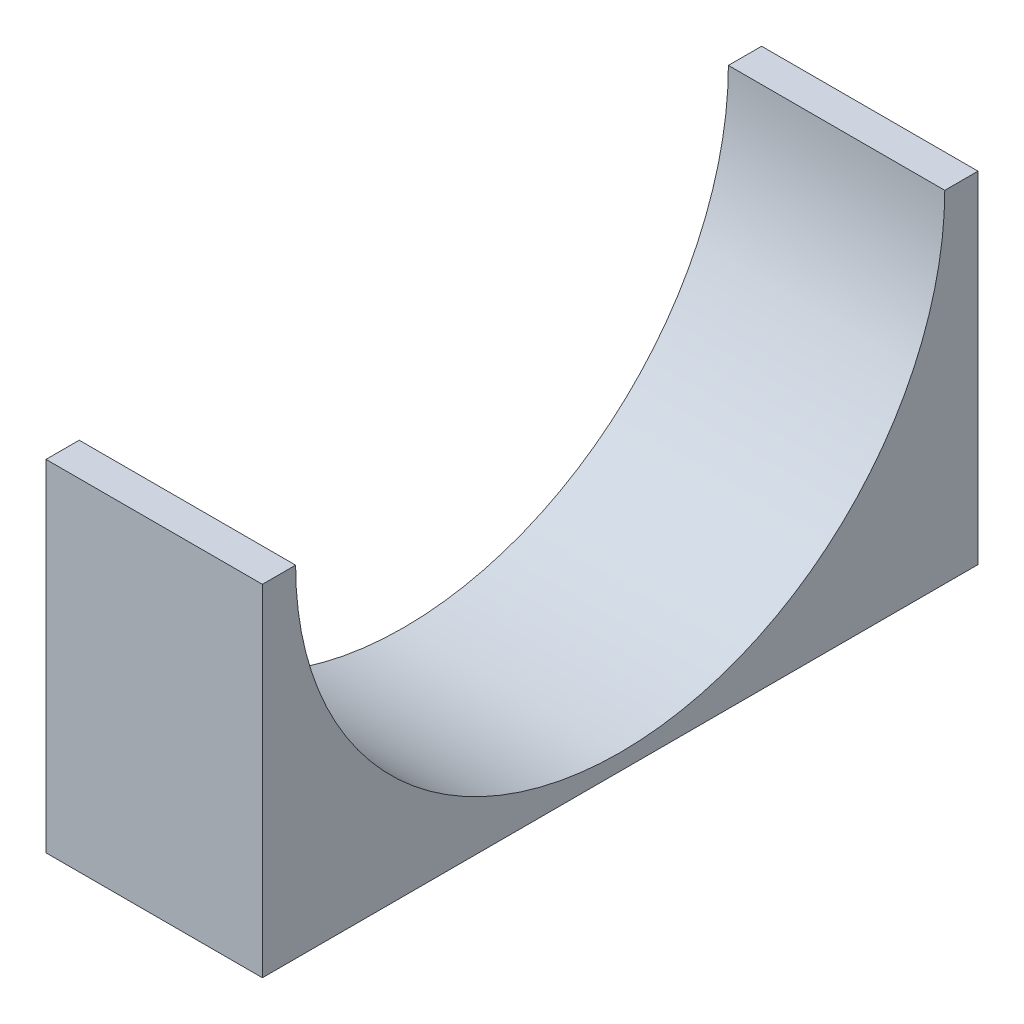
ISO-10303-21;
HEADER;
FILE_DESCRIPTION(('STEP AP214'),'2;1');
FILE_NAME('part.step','',(''),(''),'','','');
FILE_SCHEMA(('AUTOMOTIVE_DESIGN { 1 0 10303 214 1 1 1 1 }'));
ENDSEC;
DATA;
#1=APPLICATION_CONTEXT('core data for automotive mechanical design processes');
#2=APPLICATION_PROTOCOL_DEFINITION('international standard','automotive_design',2000,#1);
#3=PRODUCT_CONTEXT('',#1,'mechanical');
#4=PRODUCT('Part','Part','',(#3));
#5=PRODUCT_RELATED_PRODUCT_CATEGORY('part','',(#4));
#6=PRODUCT_DEFINITION_FORMATION('','',#4);
#7=PRODUCT_DEFINITION_CONTEXT('part definition',#1,'design');
#8=PRODUCT_DEFINITION('design','',#6,#7);
#9=PRODUCT_DEFINITION_SHAPE('','',#8);
#10=(LENGTH_UNIT() NAMED_UNIT(*) SI_UNIT(.MILLI.,.METRE.));
#11=(NAMED_UNIT(*) PLANE_ANGLE_UNIT() SI_UNIT($,.RADIAN.));
#12=(NAMED_UNIT(*) SI_UNIT($,.STERADIAN.) SOLID_ANGLE_UNIT());
#13=UNCERTAINTY_MEASURE_WITH_UNIT(LENGTH_MEASURE(1.E-05),#10,'distance_accuracy_value','');
#14=(GEOMETRIC_REPRESENTATION_CONTEXT(3) GLOBAL_UNCERTAINTY_ASSIGNED_CONTEXT((#13)) GLOBAL_UNIT_ASSIGNED_CONTEXT((#10,
#11,#12)) REPRESENTATION_CONTEXT('',''));
#15=CARTESIAN_POINT('',(0.,0.,0.));
#16=DIRECTION('',(0.,0.,1.));
#17=DIRECTION('',(1.,0.,0.));
#18=AXIS2_PLACEMENT_3D('',#15,#16,#17);
#19=CARTESIAN_POINT('',(0.,40.,0.));
#20=DIRECTION('',(0.,1.,0.));
#21=DIRECTION('',(0.,0.,1.));
#22=AXIS2_PLACEMENT_3D('',#19,#20,#21);
#23=PLANE('',#22);
#24=DIRECTION('',(1.,0.,0.));
#25=VECTOR('',#24,1.);
#26=CARTESIAN_POINT('',(-15.,40.,38.1));
#27=LINE('',#26,#25);
#28=CARTESIAN_POINT('',(-12.7,40.,38.1));
#29=VERTEX_POINT('',#28);
#30=CARTESIAN_POINT('',(12.7,40.,38.1));
#31=VERTEX_POINT('',#30);
#32=EDGE_CURVE('E11',#29,#31,#27,.T.);
#33=ORIENTED_EDGE('',*,*,#32,.F.);
#34=DIRECTION('',(0.,0.,1.));
#35=VECTOR('',#34,1.);
#36=CARTESIAN_POINT('',(-12.7,40.,-42.));
#37=LINE('',#36,#35);
#38=CARTESIAN_POINT('',(-12.7,40.,42.));
#39=VERTEX_POINT('',#38);
#40=EDGE_CURVE('E113',#29,#39,#37,.T.);
#41=ORIENTED_EDGE('',*,*,#40,.T.);
#42=DIRECTION('',(1.,0.,0.));
#43=VECTOR('',#42,1.);
#44=CARTESIAN_POINT('',(-12.7,40.,42.));
#45=LINE('',#44,#43);
#46=CARTESIAN_POINT('',(12.7,40.,42.));
#47=VERTEX_POINT('',#46);
#48=EDGE_CURVE('E63',#39,#47,#45,.T.);
#49=ORIENTED_EDGE('',*,*,#48,.T.);
#50=DIRECTION('',(0.,0.,-1.));
#51=VECTOR('',#50,1.);
#52=CARTESIAN_POINT('',(12.7,40.,-42.));
#53=LINE('',#52,#51);
#54=EDGE_CURVE('E160',#47,#31,#53,.T.);
#55=ORIENTED_EDGE('',*,*,#54,.T.);
#56=EDGE_LOOP('',(#33,#41,#49,#55));
#57=FACE_BOUND('',#56,.T.);
#58=ADVANCED_FACE('F39',(#57),#23,.T.);
#59=CARTESIAN_POINT('',(12.7,40.,-42.));
#60=DIRECTION('',(-1.,0.,0.));
#61=DIRECTION('',(0.,0.,1.));
#62=AXIS2_PLACEMENT_3D('',#59,#60,#61);
#63=PLANE('',#62);
#64=CARTESIAN_POINT('',(12.7,40.,-38.1));
#65=VERTEX_POINT('',#64);
#66=CARTESIAN_POINT('',(12.7,40.,-42.));
#67=VERTEX_POINT('',#66);
#68=EDGE_CURVE('E91',#65,#67,#53,.T.);
#69=ORIENTED_EDGE('',*,*,#68,.F.);
#70=CARTESIAN_POINT('',(12.7,40.,0.));
#71=DIRECTION('',(-1.,0.,0.));
#72=DIRECTION('',(0.,0.,1.));
#73=AXIS2_PLACEMENT_3D('',#70,#71,#72);
#74=CIRCLE('',#73,38.1);
#75=EDGE_CURVE('E54',#65,#31,#74,.T.);
#76=ORIENTED_EDGE('',*,*,#75,.T.);
#77=ORIENTED_EDGE('',*,*,#54,.F.);
#78=DIRECTION('',(0.,-1.,0.));
#79=VECTOR('',#78,1.);
#80=CARTESIAN_POINT('',(12.7,40.,42.));
#81=LINE('',#80,#79);
#82=CARTESIAN_POINT('',(12.7,0.,42.));
#83=VERTEX_POINT('',#82);
#84=EDGE_CURVE('E123',#47,#83,#81,.T.);
#85=ORIENTED_EDGE('',*,*,#84,.T.);
#86=DIRECTION('',(0.,0.,-1.));
#87=VECTOR('',#86,1.);
#88=CARTESIAN_POINT('',(12.7,0.,-42.));
#89=LINE('',#88,#87);
#90=CARTESIAN_POINT('',(12.7,0.,-42.));
#91=VERTEX_POINT('',#90);
#92=EDGE_CURVE('E128',#83,#91,#89,.T.);
#93=ORIENTED_EDGE('',*,*,#92,.T.);
#94=DIRECTION('',(0.,-1.,0.));
#95=VECTOR('',#94,1.);
#96=CARTESIAN_POINT('',(12.7,40.,-42.));
#97=LINE('',#96,#95);
#98=EDGE_CURVE('E105',#67,#91,#97,.T.);
#99=ORIENTED_EDGE('',*,*,#98,.F.);
#100=EDGE_LOOP('',(#69,#76,#77,#85,#93,#99));
#101=FACE_BOUND('',#100,.T.);
#102=ADVANCED_FACE('F41',(#101),#63,.F.);
#103=CARTESIAN_POINT('',(-12.7,40.,-42.));
#104=DIRECTION('',(0.,0.,1.));
#105=DIRECTION('',(1.,0.,0.));
#106=AXIS2_PLACEMENT_3D('',#103,#104,#105);
#107=PLANE('',#106);
#108=DIRECTION('',(-1.,0.,0.));
#109=VECTOR('',#108,1.);
#110=CARTESIAN_POINT('',(-12.7,0.,-42.));
#111=LINE('',#110,#109);
#112=CARTESIAN_POINT('',(-12.7,0.,-42.));
#113=VERTEX_POINT('',#112);
#114=EDGE_CURVE('E132',#91,#113,#111,.T.);
#115=ORIENTED_EDGE('',*,*,#114,.T.);
#116=DIRECTION('',(0.,-1.,0.));
#117=VECTOR('',#116,1.);
#118=CARTESIAN_POINT('',(-12.7,40.,-42.));
#119=LINE('',#118,#117);
#120=CARTESIAN_POINT('',(-12.7,40.,-42.));
#121=VERTEX_POINT('',#120);
#122=EDGE_CURVE('E145',#121,#113,#119,.T.);
#123=ORIENTED_EDGE('',*,*,#122,.F.);
#124=DIRECTION('',(-1.,0.,0.));
#125=VECTOR('',#124,1.);
#126=CARTESIAN_POINT('',(-12.7,40.,-42.));
#127=LINE('',#126,#125);
#128=EDGE_CURVE('E117',#67,#121,#127,.T.);
#129=ORIENTED_EDGE('',*,*,#128,.F.);
#130=ORIENTED_EDGE('',*,*,#98,.T.);
#131=EDGE_LOOP('',(#115,#123,#129,#130));
#132=FACE_BOUND('',#131,.T.);
#133=ADVANCED_FACE('F152',(#132),#107,.F.);
#134=CARTESIAN_POINT('',(-12.7,40.,-42.));
#135=DIRECTION('',(1.,0.,0.));
#136=DIRECTION('',(0.,0.,-1.));
#137=AXIS2_PLACEMENT_3D('',#134,#135,#136);
#138=PLANE('',#137);
#139=ORIENTED_EDGE('',*,*,#40,.F.);
#140=CARTESIAN_POINT('',(-12.7,40.,0.));
#141=DIRECTION('',(1.,0.,0.));
#142=DIRECTION('',(0.,0.,-1.));
#143=AXIS2_PLACEMENT_3D('',#140,#141,#142);
#144=CIRCLE('',#143,38.1);
#145=CARTESIAN_POINT('',(-12.7,40.,-38.1));
#146=VERTEX_POINT('',#145);
#147=EDGE_CURVE('E101',#29,#146,#144,.T.);
#148=ORIENTED_EDGE('',*,*,#147,.T.);
#149=EDGE_CURVE('E111',#121,#146,#37,.T.);
#150=ORIENTED_EDGE('',*,*,#149,.F.);
#151=ORIENTED_EDGE('',*,*,#122,.T.);
#152=DIRECTION('',(0.,0.,1.));
#153=VECTOR('',#152,1.);
#154=CARTESIAN_POINT('',(-12.7,0.,-42.));
#155=LINE('',#154,#153);
#156=CARTESIAN_POINT('',(-12.7,0.,42.));
#157=VERTEX_POINT('',#156);
#158=EDGE_CURVE('E135',#113,#157,#155,.T.);
#159=ORIENTED_EDGE('',*,*,#158,.T.);
#160=DIRECTION('',(0.,-1.,0.));
#161=VECTOR('',#160,1.);
#162=CARTESIAN_POINT('',(-12.7,40.,42.));
#163=LINE('',#162,#161);
#164=EDGE_CURVE('E142',#39,#157,#163,.T.);
#165=ORIENTED_EDGE('',*,*,#164,.F.);
#166=EDGE_LOOP('',(#139,#148,#150,#151,#159,#165));
#167=FACE_BOUND('',#166,.T.);
#168=ADVANCED_FACE('F109',(#167),#138,.F.);
#169=CARTESIAN_POINT('',(-12.7,40.,42.));
#170=DIRECTION('',(0.,0.,-1.));
#171=DIRECTION('',(-1.,0.,0.));
#172=AXIS2_PLACEMENT_3D('',#169,#170,#171);
#173=PLANE('',#172);
#174=DIRECTION('',(1.,0.,0.));
#175=VECTOR('',#174,1.);
#176=CARTESIAN_POINT('',(-12.7,0.,42.));
#177=LINE('',#176,#175);
#178=EDGE_CURVE('E84',#157,#83,#177,.T.);
#179=ORIENTED_EDGE('',*,*,#178,.T.);
#180=ORIENTED_EDGE('',*,*,#84,.F.);
#181=ORIENTED_EDGE('',*,*,#48,.F.);
#182=ORIENTED_EDGE('',*,*,#164,.T.);
#183=EDGE_LOOP('',(#179,#180,#181,#182));
#184=FACE_BOUND('',#183,.T.);
#185=ADVANCED_FACE('F159',(#184),#173,.F.);
#186=DIRECTION('',(1.,0.,0.));
#187=VECTOR('',#186,1.);
#188=CARTESIAN_POINT('',(-15.,40.,-38.1));
#189=LINE('',#188,#187);
#190=EDGE_CURVE('E48',#65,#146,#189,.F.);
#191=ORIENTED_EDGE('',*,*,#190,.F.);
#192=ORIENTED_EDGE('',*,*,#68,.T.);
#193=ORIENTED_EDGE('',*,*,#128,.T.);
#194=ORIENTED_EDGE('',*,*,#149,.T.);
#195=EDGE_LOOP('',(#191,#192,#193,#194));
#196=FACE_BOUND('',#195,.T.);
#197=ADVANCED_FACE('F116',(#196),#23,.T.);
#198=CARTESIAN_POINT('',(0.,0.,0.));
#199=DIRECTION('',(0.,1.,0.));
#200=DIRECTION('',(0.,0.,1.));
#201=AXIS2_PLACEMENT_3D('',#198,#199,#200);
#202=PLANE('',#201);
#203=ORIENTED_EDGE('',*,*,#92,.F.);
#204=ORIENTED_EDGE('',*,*,#178,.F.);
#205=ORIENTED_EDGE('',*,*,#158,.F.);
#206=ORIENTED_EDGE('',*,*,#114,.F.);
#207=EDGE_LOOP('',(#203,#204,#205,#206));
#208=FACE_BOUND('',#207,.T.);
#209=ADVANCED_FACE('F157',(#208),#202,.F.);
#210=CARTESIAN_POINT('',(-15.,40.,0.));
#211=DIRECTION('',(1.,0.,0.));
#212=DIRECTION('',(0.,0.,-1.));
#213=AXIS2_PLACEMENT_3D('',#210,#211,#212);
#214=CYLINDRICAL_SURFACE('',#213,38.1);
#215=ORIENTED_EDGE('',*,*,#32,.T.);
#216=ORIENTED_EDGE('',*,*,#75,.F.);
#217=ORIENTED_EDGE('',*,*,#190,.T.);
#218=ORIENTED_EDGE('',*,*,#147,.F.);
#219=EDGE_LOOP('',(#215,#216,#217,#218));
#220=FACE_BOUND('',#219,.T.);
#221=ADVANCED_FACE('F100',(#220),#214,.F.);
#222=CLOSED_SHELL('',(#58,#102,#133,#168,#185,#197,#209,#221));
#223=MANIFOLD_SOLID_BREP('B2',#222);
#224=ADVANCED_BREP_SHAPE_REPRESENTATION('',(#18,#223),#14);
#225=SHAPE_DEFINITION_REPRESENTATION(#9,#224);
ENDSEC;
END-ISO-10303-21;
